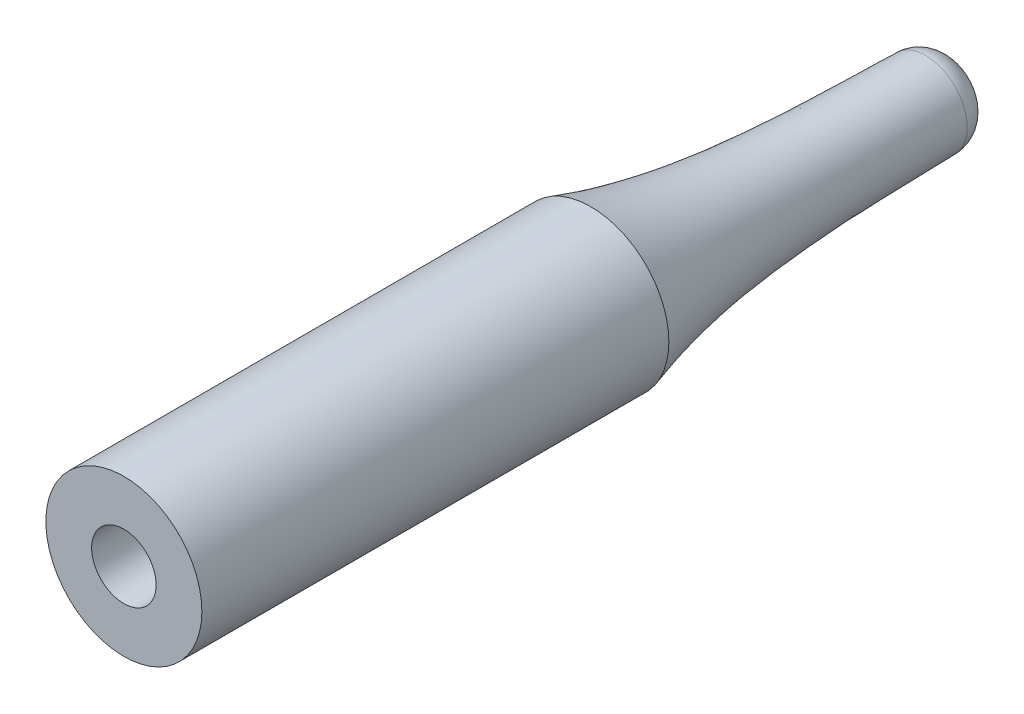
ISO-10303-21;
HEADER;
FILE_DESCRIPTION(('STEP AP214'),'2;1');
FILE_NAME('part.step','',(''),(''),'','','');
FILE_SCHEMA(('AUTOMOTIVE_DESIGN { 1 0 10303 214 1 1 1 1 }'));
ENDSEC;
DATA;
#1=APPLICATION_CONTEXT('core data for automotive mechanical design processes');
#2=APPLICATION_PROTOCOL_DEFINITION('international standard','automotive_design',2000,#1);
#3=PRODUCT_CONTEXT('',#1,'mechanical');
#4=PRODUCT('Part','Part','',(#3));
#5=PRODUCT_RELATED_PRODUCT_CATEGORY('part','',(#4));
#6=PRODUCT_DEFINITION_FORMATION('','',#4);
#7=PRODUCT_DEFINITION_CONTEXT('part definition',#1,'design');
#8=PRODUCT_DEFINITION('design','',#6,#7);
#9=PRODUCT_DEFINITION_SHAPE('','',#8);
#10=(LENGTH_UNIT() NAMED_UNIT(*) SI_UNIT(.MILLI.,.METRE.));
#11=(NAMED_UNIT(*) PLANE_ANGLE_UNIT() SI_UNIT($,.RADIAN.));
#12=(NAMED_UNIT(*) SI_UNIT($,.STERADIAN.) SOLID_ANGLE_UNIT());
#13=UNCERTAINTY_MEASURE_WITH_UNIT(LENGTH_MEASURE(1.E-05),#10,'distance_accuracy_value','');
#14=(GEOMETRIC_REPRESENTATION_CONTEXT(3) GLOBAL_UNCERTAINTY_ASSIGNED_CONTEXT((#13)) GLOBAL_UNIT_ASSIGNED_CONTEXT((#10,
#11,#12)) REPRESENTATION_CONTEXT('',''));
#15=CARTESIAN_POINT('',(0.,0.,0.));
#16=DIRECTION('',(0.,0.,1.));
#17=DIRECTION('',(1.,0.,0.));
#18=AXIS2_PLACEMENT_3D('',#15,#16,#17);
#19=CARTESIAN_POINT('',(5.67999985103449,0.,4.96992789313135));
#20=CARTESIAN_POINT('',(2.97134764402797,0.,-3.49112691907967));
#21=CARTESIAN_POINT('',(3.22245979576992,0.,-12.639585670459));
#22=CARTESIAN_POINT('',(2.97101520118939,0.,-21.3698721068686));
#23=B_SPLINE_CURVE_WITH_KNOTS('',3,(#19,#20,#21,#22),.UNSPECIFIED.,.F.,.F.,(4,4),(0.,1.),.UNSPECIFIED.);
#24=CARTESIAN_POINT('',(0.,0.,-21.3698721068686));
#25=DIRECTION('',(0.,0.,1.));
#26=AXIS1_PLACEMENT('',#24,#25);
#27=SURFACE_OF_REVOLUTION('',#23,#26);
#28=CARTESIAN_POINT('',(0.,0.,-19.4144351287393));
#29=DIRECTION('',(0.,0.,1.));
#30=DIRECTION('',(1.,0.,0.));
#31=AXIS2_PLACEMENT_3D('',#28,#29,#30);
#32=CIRCLE('',#31,3.020225787013);
#33=CARTESIAN_POINT('',(3.02022578701299,0.,-19.4144351287393));
#34=VERTEX_POINT('',#33);
#35=EDGE_CURVE('E37',#34,#34,#32,.T.);
#36=ORIENTED_EDGE('',*,*,#35,.T.);
#37=EDGE_LOOP('',(#36));
#38=FACE_BOUND('',#37,.T.);
#39=CARTESIAN_POINT('',(0.,0.,4.96992789313135));
#40=DIRECTION('',(0.,0.,1.));
#41=DIRECTION('',(1.,0.,0.));
#42=AXIS2_PLACEMENT_3D('',#39,#40,#41);
#43=CIRCLE('',#42,5.67999985103449);
#44=CARTESIAN_POINT('',(5.67999985103449,0.,4.96992789313135));
#45=VERTEX_POINT('',#44);
#46=EDGE_CURVE('E53',#45,#45,#43,.T.);
#47=ORIENTED_EDGE('',*,*,#46,.F.);
#48=EDGE_LOOP('',(#47));
#49=FACE_BOUND('',#48,.T.);
#50=ADVANCED_FACE('F30',(#38,#49),#27,.F.);
#51=CARTESIAN_POINT('',(2.97101520118939,0.,-21.3698721068686));
#52=DIRECTION('',(0.,0.,-1.));
#53=DIRECTION('',(-1.,0.,0.));
#54=AXIS2_PLACEMENT_3D('',#51,#52,#53);
#55=PLANE('',#54);
#56=CARTESIAN_POINT('',(0.,0.,-21.3698721068686));
#57=DIRECTION('',(0.,0.,-1.));
#58=DIRECTION('',(-1.,0.,0.));
#59=AXIS2_PLACEMENT_3D('',#56,#57,#58);
#60=CIRCLE('',#59,1.02072231437741);
#61=CARTESIAN_POINT('',(-1.02072231437742,0.,-21.3698721068686));
#62=VERTEX_POINT('',#61);
#63=EDGE_CURVE('E10',#62,#62,#60,.T.);
#64=ORIENTED_EDGE('',*,*,#63,.T.);
#65=EDGE_LOOP('',(#64));
#66=FACE_BOUND('',#65,.T.);
#67=ADVANCED_FACE('F64',(#66),#55,.T.);
#68=CARTESIAN_POINT('',(2.34950000000001,0.,31.8579279651314));
#69=DIRECTION('',(0.,0.,1.));
#70=DIRECTION('',(1.,0.,0.));
#71=AXIS2_PLACEMENT_3D('',#68,#69,#70);
#72=PLANE('',#71);
#73=CARTESIAN_POINT('',(0.,0.,31.8579279651314));
#74=DIRECTION('',(0.,0.,1.));
#75=DIRECTION('',(1.,0.,0.));
#76=AXIS2_PLACEMENT_3D('',#73,#74,#75);
#77=CIRCLE('',#76,2.3495);
#78=CARTESIAN_POINT('',(2.34950000000001,0.,31.8579279651314));
#79=VERTEX_POINT('',#78);
#80=EDGE_CURVE('E41',#79,#79,#77,.T.);
#81=ORIENTED_EDGE('',*,*,#80,.T.);
#82=EDGE_LOOP('',(#81));
#83=FACE_BOUND('',#82,.T.);
#84=ADVANCED_FACE('F67',(#83),#72,.T.);
#85=CARTESIAN_POINT('',(0.,0.,-21.3698721068686));
#86=DIRECTION('',(0.,0.,1.));
#87=DIRECTION('',(1.,0.,0.));
#88=AXIS2_PLACEMENT_3D('',#85,#86,#87);
#89=CYLINDRICAL_SURFACE('',#88,2.3495);
#90=CARTESIAN_POINT('',(0.,0.,38.9699279651314));
#91=DIRECTION('',(0.,0.,1.));
#92=DIRECTION('',(1.,0.,0.));
#93=AXIS2_PLACEMENT_3D('',#90,#91,#92);
#94=CIRCLE('',#93,2.3495);
#95=CARTESIAN_POINT('',(2.34950000000001,0.,38.9699279651314));
#96=VERTEX_POINT('',#95);
#97=EDGE_CURVE('E45',#96,#96,#94,.T.);
#98=ORIENTED_EDGE('',*,*,#97,.T.);
#99=EDGE_LOOP('',(#98));
#100=FACE_BOUND('',#99,.T.);
#101=ORIENTED_EDGE('',*,*,#80,.F.);
#102=EDGE_LOOP('',(#101));
#103=FACE_BOUND('',#102,.T.);
#104=ADVANCED_FACE('F70',(#100,#103),#89,.F.);
#105=CARTESIAN_POINT('',(2.34950000000001,0.,38.9699279651314));
#106=DIRECTION('',(0.,0.,1.));
#107=DIRECTION('',(1.,0.,0.));
#108=AXIS2_PLACEMENT_3D('',#105,#106,#107);
#109=PLANE('',#108);
#110=CARTESIAN_POINT('',(0.,0.,38.9699279651314));
#111=DIRECTION('',(0.,0.,1.));
#112=DIRECTION('',(1.,0.,0.));
#113=AXIS2_PLACEMENT_3D('',#110,#111,#112);
#114=CIRCLE('',#113,5.67999985103448);
#115=CARTESIAN_POINT('',(5.67999985103449,0.,38.9699279651314));
#116=VERTEX_POINT('',#115);
#117=EDGE_CURVE('E50',#116,#116,#114,.T.);
#118=ORIENTED_EDGE('',*,*,#117,.T.);
#119=EDGE_LOOP('',(#118));
#120=FACE_BOUND('',#119,.T.);
#121=ORIENTED_EDGE('',*,*,#97,.F.);
#122=EDGE_LOOP('',(#121));
#123=FACE_BOUND('',#122,.T.);
#124=ADVANCED_FACE('F74',(#120,#123),#109,.T.);
#125=CARTESIAN_POINT('',(0.,0.,-21.3698721068686));
#126=DIRECTION('',(0.,0.,1.));
#127=DIRECTION('',(1.,0.,0.));
#128=AXIS2_PLACEMENT_3D('',#125,#126,#127);
#129=CYLINDRICAL_SURFACE('',#128,5.67999985103448);
#130=ORIENTED_EDGE('',*,*,#46,.T.);
#131=EDGE_LOOP('',(#130));
#132=FACE_BOUND('',#131,.T.);
#133=ORIENTED_EDGE('',*,*,#117,.F.);
#134=EDGE_LOOP('',(#133));
#135=FACE_BOUND('',#134,.T.);
#136=ADVANCED_FACE('F78',(#132,#135),#129,.T.);
#137=CARTESIAN_POINT('',(0.,0.,-19.3698721068686));
#138=DIRECTION('',(0.,0.,1.));
#139=DIRECTION('',(1.,0.,0.));
#140=AXIS2_PLACEMENT_3D('',#137,#138,#139);
#141=DEGENERATE_TOROIDAL_SURFACE('',#140,1.02072231437741,2.,.T.);
#142=ORIENTED_EDGE('',*,*,#63,.F.);
#143=EDGE_LOOP('',(#142));
#144=FACE_BOUND('',#143,.T.);
#145=ORIENTED_EDGE('',*,*,#35,.F.);
#146=EDGE_LOOP('',(#145));
#147=FACE_BOUND('',#146,.T.);
#148=ADVANCED_FACE('F32',(#144,#147),#141,.T.);
#149=CLOSED_SHELL('',(#50,#67,#84,#104,#124,#136,#148));
#150=MANIFOLD_SOLID_BREP('B2',#149);
#151=ADVANCED_BREP_SHAPE_REPRESENTATION('',(#18,#150),#14);
#152=SHAPE_DEFINITION_REPRESENTATION(#9,#151);
ENDSEC;
END-ISO-10303-21;
